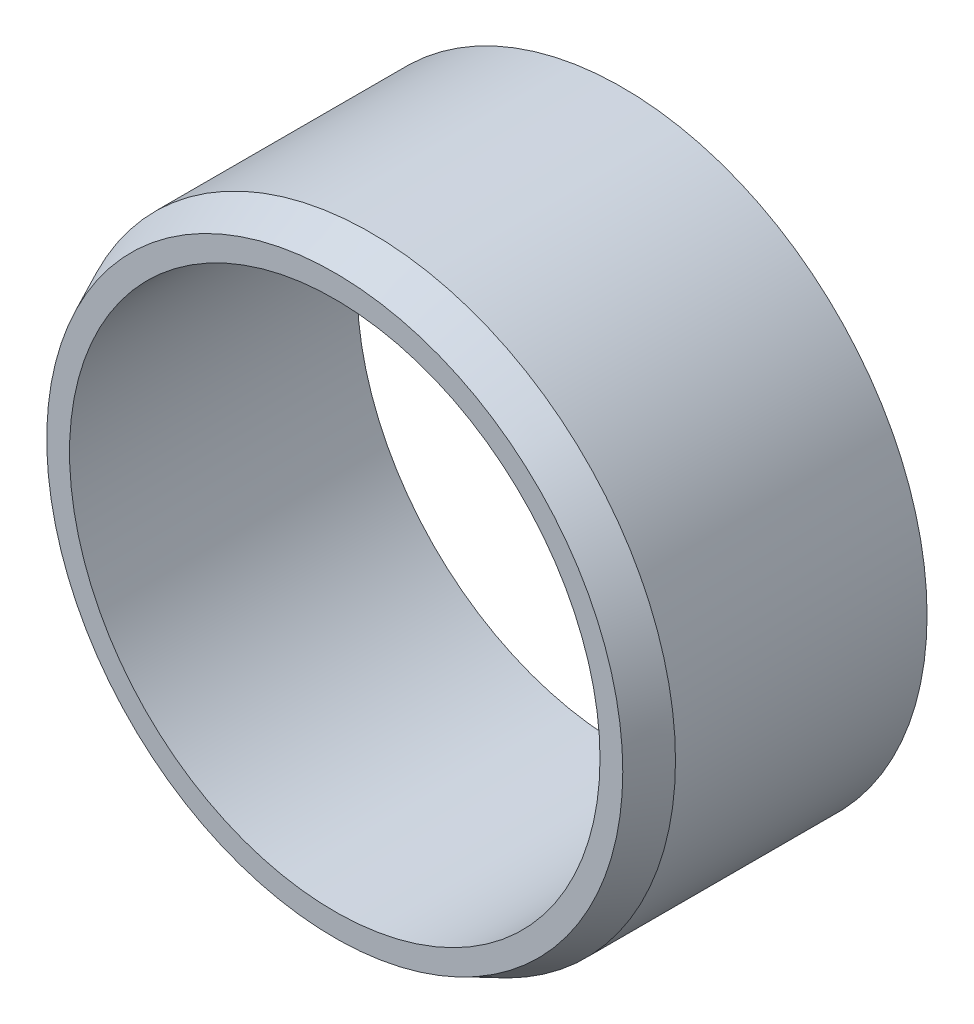
ISO-10303-21;
HEADER;
FILE_DESCRIPTION(('STEP AP214'),'2;1');
FILE_NAME('part.step','',(''),(''),'','','');
FILE_SCHEMA(('AUTOMOTIVE_DESIGN { 1 0 10303 214 1 1 1 1 }'));
ENDSEC;
DATA;
#1=APPLICATION_CONTEXT('core data for automotive mechanical design processes');
#2=APPLICATION_PROTOCOL_DEFINITION('international standard','automotive_design',2000,#1);
#3=PRODUCT_CONTEXT('',#1,'mechanical');
#4=PRODUCT('Part','Part','',(#3));
#5=PRODUCT_RELATED_PRODUCT_CATEGORY('part','',(#4));
#6=PRODUCT_DEFINITION_FORMATION('','',#4);
#7=PRODUCT_DEFINITION_CONTEXT('part definition',#1,'design');
#8=PRODUCT_DEFINITION('design','',#6,#7);
#9=PRODUCT_DEFINITION_SHAPE('','',#8);
#10=(LENGTH_UNIT() NAMED_UNIT(*) SI_UNIT(.MILLI.,.METRE.));
#11=(NAMED_UNIT(*) PLANE_ANGLE_UNIT() SI_UNIT($,.RADIAN.));
#12=(NAMED_UNIT(*) SI_UNIT($,.STERADIAN.) SOLID_ANGLE_UNIT());
#13=UNCERTAINTY_MEASURE_WITH_UNIT(LENGTH_MEASURE(1.E-05),#10,'distance_accuracy_value','');
#14=(GEOMETRIC_REPRESENTATION_CONTEXT(3) GLOBAL_UNCERTAINTY_ASSIGNED_CONTEXT((#13)) GLOBAL_UNIT_ASSIGNED_CONTEXT((#10,
#11,#12)) REPRESENTATION_CONTEXT('',''));
#15=CARTESIAN_POINT('',(0.,0.,0.));
#16=DIRECTION('',(0.,0.,1.));
#17=DIRECTION('',(1.,0.,0.));
#18=AXIS2_PLACEMENT_3D('',#15,#16,#17);
#19=CARTESIAN_POINT('',(0.,0.,10.));
#20=DIRECTION('',(0.,0.,1.));
#21=DIRECTION('',(1.,0.,0.));
#22=AXIS2_PLACEMENT_3D('',#19,#20,#21);
#23=PLANE('',#22);
#24=CARTESIAN_POINT('',(0.,0.,10.));
#25=DIRECTION('',(0.,0.,1.));
#26=DIRECTION('',(1.,0.,0.));
#27=AXIS2_PLACEMENT_3D('',#24,#25,#26);
#28=CIRCLE('',#27,10.0171154273063);
#29=CARTESIAN_POINT('',(10.0171154273063,0.,10.));
#30=VERTEX_POINT('',#29);
#31=EDGE_CURVE('E48',#30,#30,#28,.T.);
#32=ORIENTED_EDGE('',*,*,#31,.T.);
#33=EDGE_LOOP('',(#32));
#34=FACE_BOUND('',#33,.T.);
#35=CARTESIAN_POINT('',(0.,0.,10.));
#36=DIRECTION('',(0.,0.,1.));
#37=DIRECTION('',(1.,0.,0.));
#38=AXIS2_PLACEMENT_3D('',#35,#36,#37);
#39=CIRCLE('',#38,9.225);
#40=CARTESIAN_POINT('',(9.225,0.,10.));
#41=VERTEX_POINT('',#40);
#42=EDGE_CURVE('E58',#41,#41,#39,.T.);
#43=ORIENTED_EDGE('',*,*,#42,.F.);
#44=EDGE_LOOP('',(#43));
#45=FACE_BOUND('',#44,.T.);
#46=ADVANCED_FACE('F39',(#34,#45),#23,.T.);
#47=CARTESIAN_POINT('',(0.,0.,0.));
#48=DIRECTION('',(0.,0.,1.));
#49=DIRECTION('',(1.,0.,0.));
#50=AXIS2_PLACEMENT_3D('',#47,#48,#49);
#51=PLANE('',#50);
#52=CARTESIAN_POINT('',(0.,0.,0.));
#53=DIRECTION('',(0.,0.,1.));
#54=DIRECTION('',(1.,0.,0.));
#55=AXIS2_PLACEMENT_3D('',#52,#53,#54);
#56=CIRCLE('',#55,10.6);
#57=CARTESIAN_POINT('',(10.6,0.,0.));
#58=VERTEX_POINT('',#57);
#59=EDGE_CURVE('E53',#58,#58,#56,.T.);
#60=ORIENTED_EDGE('',*,*,#59,.F.);
#61=EDGE_LOOP('',(#60));
#62=FACE_BOUND('',#61,.T.);
#63=CARTESIAN_POINT('',(0.,0.,0.));
#64=DIRECTION('',(0.,0.,1.));
#65=DIRECTION('',(1.,0.,0.));
#66=AXIS2_PLACEMENT_3D('',#63,#64,#65);
#67=CIRCLE('',#66,9.225);
#68=CARTESIAN_POINT('',(9.225,0.,0.));
#69=VERTEX_POINT('',#68);
#70=EDGE_CURVE('E61',#69,#69,#67,.T.);
#71=ORIENTED_EDGE('',*,*,#70,.T.);
#72=EDGE_LOOP('',(#71));
#73=FACE_BOUND('',#72,.T.);
#74=ADVANCED_FACE('F73',(#62,#73),#51,.F.);
#75=CARTESIAN_POINT('',(0.,0.,10.));
#76=DIRECTION('',(0.,0.,-1.));
#77=DIRECTION('',(-1.,0.,0.));
#78=AXIS2_PLACEMENT_3D('',#75,#76,#77);
#79=CYLINDRICAL_SURFACE('',#78,10.6);
#80=CARTESIAN_POINT('',(0.,0.,8.75));
#81=DIRECTION('',(0.,0.,1.));
#82=DIRECTION('',(1.,0.,0.));
#83=AXIS2_PLACEMENT_3D('',#80,#81,#82);
#84=CIRCLE('',#83,10.6);
#85=CARTESIAN_POINT('',(10.6,0.,8.75));
#86=VERTEX_POINT('',#85);
#87=EDGE_CURVE('E10',#86,#86,#84,.F.);
#88=ORIENTED_EDGE('',*,*,#87,.T.);
#89=EDGE_LOOP('',(#88));
#90=FACE_BOUND('',#89,.T.);
#91=ORIENTED_EDGE('',*,*,#59,.T.);
#92=EDGE_LOOP('',(#91));
#93=FACE_BOUND('',#92,.T.);
#94=ADVANCED_FACE('F78',(#90,#93),#79,.T.);
#95=CARTESIAN_POINT('',(0.,0.,10.));
#96=DIRECTION('',(0.,0.,-1.));
#97=DIRECTION('',(-1.,0.,0.));
#98=AXIS2_PLACEMENT_3D('',#95,#96,#97);
#99=CYLINDRICAL_SURFACE('',#98,9.225);
#100=ORIENTED_EDGE('',*,*,#42,.T.);
#101=EDGE_LOOP('',(#100));
#102=FACE_BOUND('',#101,.T.);
#103=ORIENTED_EDGE('',*,*,#70,.F.);
#104=EDGE_LOOP('',(#103));
#105=FACE_BOUND('',#104,.T.);
#106=ADVANCED_FACE('F69',(#102,#105),#99,.F.);
#107=CARTESIAN_POINT('',(0.,0.,10.));
#108=DIRECTION('',(0.,0.,-1.));
#109=DIRECTION('',(-1.,0.,0.));
#110=AXIS2_PLACEMENT_3D('',#107,#108,#109);
#111=CONICAL_SURFACE('',#110,10.0171154273063,0.436332312998582);
#112=ORIENTED_EDGE('',*,*,#87,.F.);
#113=EDGE_LOOP('',(#112));
#114=FACE_BOUND('',#113,.T.);
#115=ORIENTED_EDGE('',*,*,#31,.F.);
#116=EDGE_LOOP('',(#115));
#117=FACE_BOUND('',#116,.T.);
#118=ADVANCED_FACE('F42',(#114,#117),#111,.T.);
#119=CLOSED_SHELL('',(#46,#74,#94,#106,#118));
#120=MANIFOLD_SOLID_BREP('B2',#119);
#121=ADVANCED_BREP_SHAPE_REPRESENTATION('',(#18,#120),#14);
#122=SHAPE_DEFINITION_REPRESENTATION(#9,#121);
ENDSEC;
END-ISO-10303-21;
